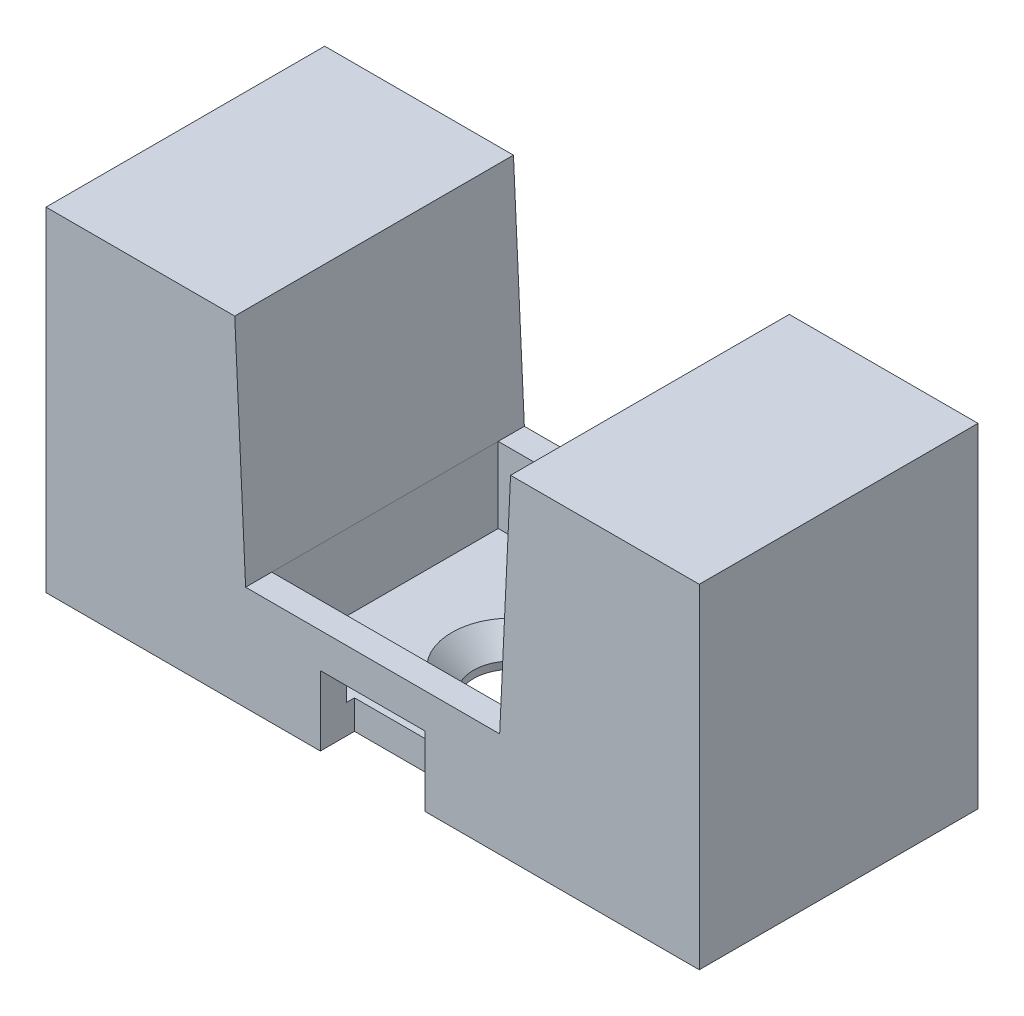
ISO-10303-21;
HEADER;
FILE_DESCRIPTION(('STEP AP214'),'2;1');
FILE_NAME('part.step','',(''),(''),'','','');
FILE_SCHEMA(('AUTOMOTIVE_DESIGN { 1 0 10303 214 1 1 1 1 }'));
ENDSEC;
DATA;
#1=APPLICATION_CONTEXT('core data for automotive mechanical design processes');
#2=APPLICATION_PROTOCOL_DEFINITION('international standard','automotive_design',2000,#1);
#3=PRODUCT_CONTEXT('',#1,'mechanical');
#4=PRODUCT('Part','Part','',(#3));
#5=PRODUCT_RELATED_PRODUCT_CATEGORY('part','',(#4));
#6=PRODUCT_DEFINITION_FORMATION('','',#4);
#7=PRODUCT_DEFINITION_CONTEXT('part definition',#1,'design');
#8=PRODUCT_DEFINITION('design','',#6,#7);
#9=PRODUCT_DEFINITION_SHAPE('','',#8);
#10=(LENGTH_UNIT() NAMED_UNIT(*) SI_UNIT(.MILLI.,.METRE.));
#11=(NAMED_UNIT(*) PLANE_ANGLE_UNIT() SI_UNIT($,.RADIAN.));
#12=(NAMED_UNIT(*) SI_UNIT($,.STERADIAN.) SOLID_ANGLE_UNIT());
#13=UNCERTAINTY_MEASURE_WITH_UNIT(LENGTH_MEASURE(1.E-05),#10,'distance_accuracy_value','');
#14=(GEOMETRIC_REPRESENTATION_CONTEXT(3) GLOBAL_UNCERTAINTY_ASSIGNED_CONTEXT((#13)) GLOBAL_UNIT_ASSIGNED_CONTEXT((#10,
#11,#12)) REPRESENTATION_CONTEXT('',''));
#15=CARTESIAN_POINT('',(0.,0.,0.));
#16=DIRECTION('',(0.,0.,1.));
#17=DIRECTION('',(1.,0.,0.));
#18=AXIS2_PLACEMENT_3D('',#15,#16,#17);
#19=CARTESIAN_POINT('',(-11.25,11.5,-4.8));
#20=DIRECTION('',(0.,0.,1.));
#21=DIRECTION('',(1.,0.,0.));
#22=AXIS2_PLACEMENT_3D('',#19,#20,#21);
#23=PLANE('',#22);
#24=DIRECTION('',(0.,-1.,0.));
#25=VECTOR('',#24,1.);
#26=CARTESIAN_POINT('',(-1.8,2.4,-4.8));
#27=LINE('',#26,#25);
#28=CARTESIAN_POINT('',(-1.8,2.4,-4.8));
#29=VERTEX_POINT('',#28);
#30=CARTESIAN_POINT('',(-1.8,0.,-4.8));
#31=VERTEX_POINT('',#30);
#32=EDGE_CURVE('E201',#29,#31,#27,.T.);
#33=ORIENTED_EDGE('',*,*,#32,.T.);
#34=DIRECTION('',(-1.,0.,0.));
#35=VECTOR('',#34,1.);
#36=CARTESIAN_POINT('',(-11.25,0.,-4.8));
#37=LINE('',#36,#35);
#38=CARTESIAN_POINT('',(-11.25,0.,-4.8));
#39=VERTEX_POINT('',#38);
#40=EDGE_CURVE('E404',#31,#39,#37,.T.);
#41=ORIENTED_EDGE('',*,*,#40,.T.);
#42=DIRECTION('',(0.,-1.,0.));
#43=VECTOR('',#42,1.);
#44=CARTESIAN_POINT('',(-11.25,11.5,-4.8));
#45=LINE('',#44,#43);
#46=CARTESIAN_POINT('',(-11.25,11.5,-4.8));
#47=VERTEX_POINT('',#46);
#48=EDGE_CURVE('E422',#47,#39,#45,.T.);
#49=ORIENTED_EDGE('',*,*,#48,.F.);
#50=DIRECTION('',(-1.,0.,0.));
#51=VECTOR('',#50,1.);
#52=CARTESIAN_POINT('',(-11.25,11.5,-4.8));
#53=LINE('',#52,#51);
#54=CARTESIAN_POINT('',(-4.75,11.5,-4.8));
#55=VERTEX_POINT('',#54);
#56=EDGE_CURVE('E386',#55,#47,#53,.T.);
#57=ORIENTED_EDGE('',*,*,#56,.F.);
#58=DIRECTION('',(0.0474149657284516,-0.998875278012711,0.));
#59=VECTOR('',#58,1.);
#60=CARTESIAN_POINT('',(-4.375,3.6,-4.8));
#61=LINE('',#60,#59);
#62=CARTESIAN_POINT('',(-4.375,3.6,-4.8));
#63=VERTEX_POINT('',#62);
#64=EDGE_CURVE('E342',#55,#63,#61,.T.);
#65=ORIENTED_EDGE('',*,*,#64,.T.);
#66=DIRECTION('',(1.,0.,0.));
#67=VECTOR('',#66,1.);
#68=CARTESIAN_POINT('',(4.375,3.6,-4.8));
#69=LINE('',#68,#67);
#70=CARTESIAN_POINT('',(4.375,3.6,-4.8));
#71=VERTEX_POINT('',#70);
#72=EDGE_CURVE('E346',#63,#71,#69,.T.);
#73=ORIENTED_EDGE('',*,*,#72,.T.);
#74=DIRECTION('',(0.0474149657284512,0.998875278012711,0.));
#75=VECTOR('',#74,1.);
#76=CARTESIAN_POINT('',(4.75,11.5,-4.8));
#77=LINE('',#76,#75);
#78=CARTESIAN_POINT('',(4.75,11.5,-4.8));
#79=VERTEX_POINT('',#78);
#80=EDGE_CURVE('E351',#71,#79,#77,.T.);
#81=ORIENTED_EDGE('',*,*,#80,.T.);
#82=CARTESIAN_POINT('',(11.25,11.5,-4.8));
#83=VERTEX_POINT('',#82);
#84=EDGE_CURVE('E388',#83,#79,#53,.T.);
#85=ORIENTED_EDGE('',*,*,#84,.F.);
#86=DIRECTION('',(0.,-1.,0.));
#87=VECTOR('',#86,1.);
#88=CARTESIAN_POINT('',(11.25,11.5,-4.8));
#89=LINE('',#88,#87);
#90=CARTESIAN_POINT('',(11.25,0.,-4.8));
#91=VERTEX_POINT('',#90);
#92=EDGE_CURVE('E426',#83,#91,#89,.T.);
#93=ORIENTED_EDGE('',*,*,#92,.T.);
#94=CARTESIAN_POINT('',(1.8,0.,-4.8));
#95=VERTEX_POINT('',#94);
#96=EDGE_CURVE('E405',#91,#95,#37,.T.);
#97=ORIENTED_EDGE('',*,*,#96,.T.);
#98=DIRECTION('',(0.,-1.,0.));
#99=VECTOR('',#98,1.);
#100=CARTESIAN_POINT('',(1.8,2.4,-4.8));
#101=LINE('',#100,#99);
#102=CARTESIAN_POINT('',(1.8,2.4,-4.8));
#103=VERTEX_POINT('',#102);
#104=EDGE_CURVE('E57',#103,#95,#101,.T.);
#105=ORIENTED_EDGE('',*,*,#104,.F.);
#106=DIRECTION('',(-1.,0.,0.));
#107=VECTOR('',#106,1.);
#108=CARTESIAN_POINT('',(-1.8,2.4,-4.8));
#109=LINE('',#108,#107);
#110=EDGE_CURVE('E218',#103,#29,#109,.T.);
#111=ORIENTED_EDGE('',*,*,#110,.T.);
#112=EDGE_LOOP('',(#33,#41,#49,#57,#65,#73,#81,#85,#93,#97,#105,#111));
#113=FACE_BOUND('',#112,.T.);
#114=ADVANCED_FACE('F41',(#113),#23,.F.);
#115=CARTESIAN_POINT('',(0.,0.,0.));
#116=DIRECTION('',(0.,1.,0.));
#117=DIRECTION('',(0.,0.,1.));
#118=AXIS2_PLACEMENT_3D('',#115,#116,#117);
#119=PLANE('',#118);
#120=CARTESIAN_POINT('',(0.,0.,0.));
#121=DIRECTION('',(0.,1.,0.));
#122=DIRECTION('',(0.,0.,1.));
#123=AXIS2_PLACEMENT_3D('',#120,#121,#122);
#124=CIRCLE('',#123,1.325);
#125=CARTESIAN_POINT('',(0.,0.,1.325));
#126=VERTEX_POINT('',#125);
#127=EDGE_CURVE('E293',#126,#126,#124,.T.);
#128=ORIENTED_EDGE('',*,*,#127,.T.);
#129=EDGE_LOOP('',(#128));
#130=FACE_BOUND('',#129,.T.);
#131=DIRECTION('',(0.,0.,1.));
#132=VECTOR('',#131,1.);
#133=CARTESIAN_POINT('',(-1.8,0.,-4.8));
#134=LINE('',#133,#132);
#135=CARTESIAN_POINT('',(-1.8,0.,-3.625));
#136=VERTEX_POINT('',#135);
#137=EDGE_CURVE('E207',#31,#136,#134,.T.);
#138=ORIENTED_EDGE('',*,*,#137,.T.);
#139=DIRECTION('',(1.,0.,0.));
#140=VECTOR('',#139,1.);
#141=CARTESIAN_POINT('',(-1.8,0.,-3.625));
#142=LINE('',#141,#140);
#143=CARTESIAN_POINT('',(1.8,0.,-3.625));
#144=VERTEX_POINT('',#143);
#145=EDGE_CURVE('E221',#136,#144,#142,.T.);
#146=ORIENTED_EDGE('',*,*,#145,.T.);
#147=DIRECTION('',(0.,0.,-1.));
#148=VECTOR('',#147,1.);
#149=CARTESIAN_POINT('',(1.8,0.,-4.8));
#150=LINE('',#149,#148);
#151=EDGE_CURVE('E231',#144,#95,#150,.T.);
#152=ORIENTED_EDGE('',*,*,#151,.T.);
#153=ORIENTED_EDGE('',*,*,#96,.F.);
#154=DIRECTION('',(0.,0.,-1.));
#155=VECTOR('',#154,1.);
#156=CARTESIAN_POINT('',(11.25,0.,-4.8));
#157=LINE('',#156,#155);
#158=CARTESIAN_POINT('',(11.25,0.,4.8));
#159=VERTEX_POINT('',#158);
#160=EDGE_CURVE('E369',#159,#91,#157,.T.);
#161=ORIENTED_EDGE('',*,*,#160,.F.);
#162=DIRECTION('',(1.,0.,0.));
#163=VECTOR('',#162,1.);
#164=CARTESIAN_POINT('',(-11.25,0.,4.8));
#165=LINE('',#164,#163);
#166=CARTESIAN_POINT('',(1.8,0.,4.8));
#167=VERTEX_POINT('',#166);
#168=EDGE_CURVE('E411',#167,#159,#165,.T.);
#169=ORIENTED_EDGE('',*,*,#168,.F.);
#170=DIRECTION('',(0.,0.,1.));
#171=VECTOR('',#170,1.);
#172=CARTESIAN_POINT('',(1.8,0.,4.8));
#173=LINE('',#172,#171);
#174=CARTESIAN_POINT('',(1.8,0.,3.625));
#175=VERTEX_POINT('',#174);
#176=EDGE_CURVE('E256',#175,#167,#173,.T.);
#177=ORIENTED_EDGE('',*,*,#176,.F.);
#178=DIRECTION('',(1.,0.,0.));
#179=VECTOR('',#178,1.);
#180=CARTESIAN_POINT('',(-1.8,0.,3.625));
#181=LINE('',#180,#179);
#182=CARTESIAN_POINT('',(-1.8,0.,3.625));
#183=VERTEX_POINT('',#182);
#184=EDGE_CURVE('E266',#183,#175,#181,.T.);
#185=ORIENTED_EDGE('',*,*,#184,.F.);
#186=DIRECTION('',(0.,0.,-1.));
#187=VECTOR('',#186,1.);
#188=CARTESIAN_POINT('',(-1.8,0.,4.8));
#189=LINE('',#188,#187);
#190=CARTESIAN_POINT('',(-1.8,0.,4.8));
#191=VERTEX_POINT('',#190);
#192=EDGE_CURVE('E250',#191,#183,#189,.T.);
#193=ORIENTED_EDGE('',*,*,#192,.F.);
#194=CARTESIAN_POINT('',(-11.25,0.,4.8));
#195=VERTEX_POINT('',#194);
#196=EDGE_CURVE('E387',#195,#191,#165,.T.);
#197=ORIENTED_EDGE('',*,*,#196,.F.);
#198=DIRECTION('',(0.,0.,1.));
#199=VECTOR('',#198,1.);
#200=CARTESIAN_POINT('',(-11.25,0.,-4.8));
#201=LINE('',#200,#199);
#202=EDGE_CURVE('E408',#39,#195,#201,.T.);
#203=ORIENTED_EDGE('',*,*,#202,.F.);
#204=ORIENTED_EDGE('',*,*,#40,.F.);
#205=EDGE_LOOP('',(#138,#146,#152,#153,#161,#169,#177,#185,#193,#197,#203,#204));
#206=FACE_BOUND('',#205,.T.);
#207=ADVANCED_FACE('F520',(#130,#206),#119,.F.);
#208=CARTESIAN_POINT('',(-4.375,-11.7218812483321,-3.9));
#209=DIRECTION('',(0.,0.,-1.));
#210=DIRECTION('',(-1.,0.,0.));
#211=AXIS2_PLACEMENT_3D('',#208,#209,#210);
#212=PLANE('',#211);
#213=DIRECTION('',(0.,-1.,0.));
#214=VECTOR('',#213,1.);
#215=CARTESIAN_POINT('',(-1.8,-11.7218812483321,-3.9));
#216=LINE('',#215,#214);
#217=CARTESIAN_POINT('',(-1.8,2.4,-3.9));
#218=VERTEX_POINT('',#217);
#219=CARTESIAN_POINT('',(-1.8,1.,-3.9));
#220=VERTEX_POINT('',#219);
#221=EDGE_CURVE('E247',#218,#220,#216,.T.);
#222=ORIENTED_EDGE('',*,*,#221,.F.);
#223=DIRECTION('',(-1.,0.,0.));
#224=VECTOR('',#223,1.);
#225=CARTESIAN_POINT('',(-4.375,2.4,-3.9));
#226=LINE('',#225,#224);
#227=CARTESIAN_POINT('',(1.8,2.4,-3.9));
#228=VERTEX_POINT('',#227);
#229=EDGE_CURVE('E12',#228,#218,#226,.T.);
#230=ORIENTED_EDGE('',*,*,#229,.F.);
#231=DIRECTION('',(0.,1.,0.));
#232=VECTOR('',#231,1.);
#233=CARTESIAN_POINT('',(1.8,-11.7218812483321,-3.9));
#234=LINE('',#233,#232);
#235=CARTESIAN_POINT('',(1.8,1.,-3.9));
#236=VERTEX_POINT('',#235);
#237=EDGE_CURVE('E240',#236,#228,#234,.T.);
#238=ORIENTED_EDGE('',*,*,#237,.F.);
#239=DIRECTION('',(1.,0.,0.));
#240=VECTOR('',#239,1.);
#241=CARTESIAN_POINT('',(-4.375,1.,-3.9));
#242=LINE('',#241,#240);
#243=CARTESIAN_POINT('',(4.375,1.,-3.9));
#244=VERTEX_POINT('',#243);
#245=EDGE_CURVE('E310',#236,#244,#242,.T.);
#246=ORIENTED_EDGE('',*,*,#245,.T.);
#247=DIRECTION('',(0.,1.,0.));
#248=VECTOR('',#247,1.);
#249=CARTESIAN_POINT('',(4.375,-11.7218812483321,-3.9));
#250=LINE('',#249,#248);
#251=CARTESIAN_POINT('',(4.375,3.6,-3.9));
#252=VERTEX_POINT('',#251);
#253=EDGE_CURVE('E325',#244,#252,#250,.T.);
#254=ORIENTED_EDGE('',*,*,#253,.T.);
#255=DIRECTION('',(-1.,0.,0.));
#256=VECTOR('',#255,1.);
#257=CARTESIAN_POINT('',(-4.375,3.6,-3.9));
#258=LINE('',#257,#256);
#259=CARTESIAN_POINT('',(-4.375,3.6,-3.9));
#260=VERTEX_POINT('',#259);
#261=EDGE_CURVE('E314',#252,#260,#258,.T.);
#262=ORIENTED_EDGE('',*,*,#261,.T.);
#263=DIRECTION('',(0.,1.,0.));
#264=VECTOR('',#263,1.);
#265=CARTESIAN_POINT('',(-4.375,-11.7218812483321,-3.9));
#266=LINE('',#265,#264);
#267=CARTESIAN_POINT('',(-4.375,1.,-3.9));
#268=VERTEX_POINT('',#267);
#269=EDGE_CURVE('E331',#268,#260,#266,.T.);
#270=ORIENTED_EDGE('',*,*,#269,.F.);
#271=EDGE_CURVE('E337',#268,#220,#242,.T.);
#272=ORIENTED_EDGE('',*,*,#271,.T.);
#273=EDGE_LOOP('',(#222,#230,#238,#246,#254,#262,#270,#272));
#274=FACE_BOUND('',#273,.T.);
#275=ADVANCED_FACE('F467',(#274),#212,.F.);
#276=CARTESIAN_POINT('',(0.,1.,0.));
#277=DIRECTION('',(0.,1.,0.));
#278=DIRECTION('',(0.,0.,1.));
#279=AXIS2_PLACEMENT_3D('',#276,#277,#278);
#280=PLANE('',#279);
#281=CARTESIAN_POINT('',(0.,1.,0.));
#282=DIRECTION('',(0.,1.,0.));
#283=DIRECTION('',(0.,0.,1.));
#284=AXIS2_PLACEMENT_3D('',#281,#282,#283);
#285=CIRCLE('',#284,2.075);
#286=CARTESIAN_POINT('',(0.,1.,2.075));
#287=VERTEX_POINT('',#286);
#288=EDGE_CURVE('E434',#287,#287,#285,.F.);
#289=ORIENTED_EDGE('',*,*,#288,.T.);
#290=EDGE_LOOP('',(#289));
#291=FACE_BOUND('',#290,.T.);
#292=DIRECTION('',(-1.,0.,0.));
#293=VECTOR('',#292,1.);
#294=CARTESIAN_POINT('',(0.,1.,-3.625));
#295=LINE('',#294,#293);
#296=CARTESIAN_POINT('',(1.8,1.,-3.625));
#297=VERTEX_POINT('',#296);
#298=CARTESIAN_POINT('',(-1.8,1.,-3.625));
#299=VERTEX_POINT('',#298);
#300=EDGE_CURVE('E455',#297,#299,#295,.T.);
#301=ORIENTED_EDGE('',*,*,#300,.T.);
#302=DIRECTION('',(0.,0.,-1.));
#303=VECTOR('',#302,1.);
#304=CARTESIAN_POINT('',(-1.8,1.,0.));
#305=LINE('',#304,#303);
#306=EDGE_CURVE('E50',#299,#220,#305,.T.);
#307=ORIENTED_EDGE('',*,*,#306,.T.);
#308=ORIENTED_EDGE('',*,*,#271,.F.);
#309=DIRECTION('',(0.,0.,-1.));
#310=VECTOR('',#309,1.);
#311=CARTESIAN_POINT('',(-4.375,1.,3.9));
#312=LINE('',#311,#310);
#313=CARTESIAN_POINT('',(-4.375,1.,3.9));
#314=VERTEX_POINT('',#313);
#315=EDGE_CURVE('E298',#314,#268,#312,.T.);
#316=ORIENTED_EDGE('',*,*,#315,.F.);
#317=DIRECTION('',(-1.,0.,0.));
#318=VECTOR('',#317,1.);
#319=CARTESIAN_POINT('',(-4.375,1.,3.9));
#320=LINE('',#319,#318);
#321=CARTESIAN_POINT('',(-1.8,1.,3.9));
#322=VERTEX_POINT('',#321);
#323=EDGE_CURVE('E301',#322,#314,#320,.T.);
#324=ORIENTED_EDGE('',*,*,#323,.F.);
#325=DIRECTION('',(0.,0.,1.));
#326=VECTOR('',#325,1.);
#327=CARTESIAN_POINT('',(-1.8,1.,0.));
#328=LINE('',#327,#326);
#329=CARTESIAN_POINT('',(-1.8,1.,3.625));
#330=VERTEX_POINT('',#329);
#331=EDGE_CURVE('E445',#330,#322,#328,.T.);
#332=ORIENTED_EDGE('',*,*,#331,.F.);
#333=DIRECTION('',(-1.,0.,0.));
#334=VECTOR('',#333,1.);
#335=CARTESIAN_POINT('',(0.,1.,3.625));
#336=LINE('',#335,#334);
#337=CARTESIAN_POINT('',(1.8,1.,3.625));
#338=VERTEX_POINT('',#337);
#339=EDGE_CURVE('E438',#338,#330,#336,.T.);
#340=ORIENTED_EDGE('',*,*,#339,.F.);
#341=DIRECTION('',(0.,0.,-1.));
#342=VECTOR('',#341,1.);
#343=CARTESIAN_POINT('',(1.8,1.,0.));
#344=LINE('',#343,#342);
#345=CARTESIAN_POINT('',(1.8,1.,3.9));
#346=VERTEX_POINT('',#345);
#347=EDGE_CURVE('E441',#346,#338,#344,.T.);
#348=ORIENTED_EDGE('',*,*,#347,.F.);
#349=CARTESIAN_POINT('',(4.375,1.,3.9));
#350=VERTEX_POINT('',#349);
#351=EDGE_CURVE('E303',#350,#346,#320,.T.);
#352=ORIENTED_EDGE('',*,*,#351,.F.);
#353=DIRECTION('',(0.,0.,1.));
#354=VECTOR('',#353,1.);
#355=CARTESIAN_POINT('',(4.375,1.,3.9));
#356=LINE('',#355,#354);
#357=EDGE_CURVE('E307',#244,#350,#356,.T.);
#358=ORIENTED_EDGE('',*,*,#357,.F.);
#359=ORIENTED_EDGE('',*,*,#245,.F.);
#360=DIRECTION('',(0.,0.,1.));
#361=VECTOR('',#360,1.);
#362=CARTESIAN_POINT('',(1.8,1.,0.));
#363=LINE('',#362,#361);
#364=EDGE_CURVE('E451',#236,#297,#363,.T.);
#365=ORIENTED_EDGE('',*,*,#364,.T.);
#366=EDGE_LOOP('',(#301,#307,#308,#316,#324,#332,#340,#348,#352,#358,#359,#365));
#367=FACE_BOUND('',#366,.T.);
#368=ADVANCED_FACE('F462',(#291,#367),#280,.T.);
#369=CARTESIAN_POINT('',(4.375,3.6,-4.8));
#370=DIRECTION('',(0.,-1.,0.));
#371=DIRECTION('',(0.,0.,-1.));
#372=AXIS2_PLACEMENT_3D('',#369,#370,#371);
#373=PLANE('',#372);
#374=DIRECTION('',(0.,0.,1.));
#375=VECTOR('',#374,1.);
#376=CARTESIAN_POINT('',(4.375,3.6,-4.8));
#377=LINE('',#376,#375);
#378=CARTESIAN_POINT('',(4.375,3.6,3.9));
#379=VERTEX_POINT('',#378);
#380=CARTESIAN_POINT('',(4.375,3.6,4.8));
#381=VERTEX_POINT('',#380);
#382=EDGE_CURVE('E374',#379,#381,#377,.T.);
#383=ORIENTED_EDGE('',*,*,#382,.F.);
#384=DIRECTION('',(1.,0.,0.));
#385=VECTOR('',#384,1.);
#386=CARTESIAN_POINT('',(-4.375,3.6,3.9));
#387=LINE('',#386,#385);
#388=CARTESIAN_POINT('',(-4.375,3.6,3.9));
#389=VERTEX_POINT('',#388);
#390=EDGE_CURVE('E321',#389,#379,#387,.T.);
#391=ORIENTED_EDGE('',*,*,#390,.F.);
#392=DIRECTION('',(0.,0.,1.));
#393=VECTOR('',#392,1.);
#394=CARTESIAN_POINT('',(-4.375,3.6,-4.8));
#395=LINE('',#394,#393);
#396=CARTESIAN_POINT('',(-4.375,3.6,4.8));
#397=VERTEX_POINT('',#396);
#398=EDGE_CURVE('E379',#389,#397,#395,.T.);
#399=ORIENTED_EDGE('',*,*,#398,.T.);
#400=DIRECTION('',(1.,0.,0.));
#401=VECTOR('',#400,1.);
#402=CARTESIAN_POINT('',(4.375,3.6,4.8));
#403=LINE('',#402,#401);
#404=EDGE_CURVE('E359',#397,#381,#403,.T.);
#405=ORIENTED_EDGE('',*,*,#404,.T.);
#406=EDGE_LOOP('',(#383,#391,#399,#405));
#407=FACE_BOUND('',#406,.T.);
#408=ADVANCED_FACE('F498',(#407),#373,.F.);
#409=CARTESIAN_POINT('',(0.,11.5,0.));
#410=DIRECTION('',(0.,1.,0.));
#411=DIRECTION('',(0.,0.,1.));
#412=AXIS2_PLACEMENT_3D('',#409,#410,#411);
#413=PLANE('',#412);
#414=DIRECTION('',(0.,0.,1.));
#415=VECTOR('',#414,1.);
#416=CARTESIAN_POINT('',(4.75,11.5,-4.8));
#417=LINE('',#416,#415);
#418=CARTESIAN_POINT('',(4.75,11.5,4.8));
#419=VERTEX_POINT('',#418);
#420=EDGE_CURVE('E365',#79,#419,#417,.T.);
#421=ORIENTED_EDGE('',*,*,#420,.T.);
#422=DIRECTION('',(1.,0.,0.));
#423=VECTOR('',#422,1.);
#424=CARTESIAN_POINT('',(-11.25,11.5,4.8));
#425=LINE('',#424,#423);
#426=CARTESIAN_POINT('',(11.25,11.5,4.8));
#427=VERTEX_POINT('',#426);
#428=EDGE_CURVE('E395',#419,#427,#425,.T.);
#429=ORIENTED_EDGE('',*,*,#428,.T.);
#430=DIRECTION('',(0.,0.,-1.));
#431=VECTOR('',#430,1.);
#432=CARTESIAN_POINT('',(11.25,11.5,-4.8));
#433=LINE('',#432,#431);
#434=EDGE_CURVE('E382',#427,#83,#433,.T.);
#435=ORIENTED_EDGE('',*,*,#434,.T.);
#436=ORIENTED_EDGE('',*,*,#84,.T.);
#437=EDGE_LOOP('',(#421,#429,#435,#436));
#438=FACE_BOUND('',#437,.T.);
#439=ADVANCED_FACE('F563',(#438),#413,.T.);
#440=CARTESIAN_POINT('',(11.25,11.5,-4.8));
#441=DIRECTION('',(-1.,0.,0.));
#442=DIRECTION('',(0.,0.,1.));
#443=AXIS2_PLACEMENT_3D('',#440,#441,#442);
#444=PLANE('',#443);
#445=ORIENTED_EDGE('',*,*,#160,.T.);
#446=ORIENTED_EDGE('',*,*,#92,.F.);
#447=ORIENTED_EDGE('',*,*,#434,.F.);
#448=DIRECTION('',(0.,-1.,0.));
#449=VECTOR('',#448,1.);
#450=CARTESIAN_POINT('',(11.25,11.5,4.8));
#451=LINE('',#450,#449);
#452=EDGE_CURVE('E400',#427,#159,#451,.T.);
#453=ORIENTED_EDGE('',*,*,#452,.T.);
#454=EDGE_LOOP('',(#445,#446,#447,#453));
#455=FACE_BOUND('',#454,.T.);
#456=ADVANCED_FACE('F561',(#455),#444,.F.);
#457=CARTESIAN_POINT('',(-11.25,11.5,-4.8));
#458=DIRECTION('',(1.,0.,0.));
#459=DIRECTION('',(0.,0.,-1.));
#460=AXIS2_PLACEMENT_3D('',#457,#458,#459);
#461=PLANE('',#460);
#462=ORIENTED_EDGE('',*,*,#202,.T.);
#463=DIRECTION('',(0.,-1.,0.));
#464=VECTOR('',#463,1.);
#465=CARTESIAN_POINT('',(-11.25,11.5,4.8));
#466=LINE('',#465,#464);
#467=CARTESIAN_POINT('',(-11.25,11.5,4.8));
#468=VERTEX_POINT('',#467);
#469=EDGE_CURVE('E418',#468,#195,#466,.T.);
#470=ORIENTED_EDGE('',*,*,#469,.F.);
#471=DIRECTION('',(0.,0.,1.));
#472=VECTOR('',#471,1.);
#473=CARTESIAN_POINT('',(-11.25,11.5,-4.8));
#474=LINE('',#473,#472);
#475=EDGE_CURVE('E392',#47,#468,#474,.T.);
#476=ORIENTED_EDGE('',*,*,#475,.F.);
#477=ORIENTED_EDGE('',*,*,#48,.T.);
#478=EDGE_LOOP('',(#462,#470,#476,#477));
#479=FACE_BOUND('',#478,.T.);
#480=ADVANCED_FACE('F559',(#479),#461,.F.);
#481=CARTESIAN_POINT('',(-11.25,11.5,4.8));
#482=DIRECTION('',(0.,0.,-1.));
#483=DIRECTION('',(-1.,0.,0.));
#484=AXIS2_PLACEMENT_3D('',#481,#482,#483);
#485=PLANE('',#484);
#486=ORIENTED_EDGE('',*,*,#196,.T.);
#487=DIRECTION('',(0.,-1.,0.));
#488=VECTOR('',#487,1.);
#489=CARTESIAN_POINT('',(-1.8,2.4,4.8));
#490=LINE('',#489,#488);
#491=CARTESIAN_POINT('',(-1.8,2.4,4.8));
#492=VERTEX_POINT('',#491);
#493=EDGE_CURVE('E272',#492,#191,#490,.T.);
#494=ORIENTED_EDGE('',*,*,#493,.F.);
#495=DIRECTION('',(-1.,0.,0.));
#496=VECTOR('',#495,1.);
#497=CARTESIAN_POINT('',(-1.8,2.4,4.8));
#498=LINE('',#497,#496);
#499=CARTESIAN_POINT('',(1.8,2.4,4.8));
#500=VERTEX_POINT('',#499);
#501=EDGE_CURVE('E259',#500,#492,#498,.T.);
#502=ORIENTED_EDGE('',*,*,#501,.F.);
#503=DIRECTION('',(0.,-1.,0.));
#504=VECTOR('',#503,1.);
#505=CARTESIAN_POINT('',(1.8,2.4,4.8));
#506=LINE('',#505,#504);
#507=EDGE_CURVE('E276',#500,#167,#506,.T.);
#508=ORIENTED_EDGE('',*,*,#507,.T.);
#509=ORIENTED_EDGE('',*,*,#168,.T.);
#510=ORIENTED_EDGE('',*,*,#452,.F.);
#511=ORIENTED_EDGE('',*,*,#428,.F.);
#512=DIRECTION('',(0.0474149657284512,0.998875278012711,0.));
#513=VECTOR('',#512,1.);
#514=CARTESIAN_POINT('',(4.75,11.5,4.8));
#515=LINE('',#514,#513);
#516=EDGE_CURVE('E347',#381,#419,#515,.T.);
#517=ORIENTED_EDGE('',*,*,#516,.F.);
#518=ORIENTED_EDGE('',*,*,#404,.F.);
#519=DIRECTION('',(0.0474149657284516,-0.998875278012711,0.));
#520=VECTOR('',#519,1.);
#521=CARTESIAN_POINT('',(-4.375,3.6,4.8));
#522=LINE('',#521,#520);
#523=CARTESIAN_POINT('',(-4.75,11.5,4.8));
#524=VERTEX_POINT('',#523);
#525=EDGE_CURVE('E341',#524,#397,#522,.T.);
#526=ORIENTED_EDGE('',*,*,#525,.F.);
#527=EDGE_CURVE('E396',#468,#524,#425,.T.);
#528=ORIENTED_EDGE('',*,*,#527,.F.);
#529=ORIENTED_EDGE('',*,*,#469,.T.);
#530=EDGE_LOOP('',(#486,#494,#502,#508,#509,#510,#511,#517,#518,#526,#528,#529));
#531=FACE_BOUND('',#530,.T.);
#532=ADVANCED_FACE('F491',(#531),#485,.F.);
#533=DIRECTION('',(0.,0.,1.));
#534=VECTOR('',#533,1.);
#535=CARTESIAN_POINT('',(-4.75,11.5,-4.8));
#536=LINE('',#535,#534);
#537=EDGE_CURVE('E355',#55,#524,#536,.T.);
#538=ORIENTED_EDGE('',*,*,#537,.F.);
#539=ORIENTED_EDGE('',*,*,#56,.T.);
#540=ORIENTED_EDGE('',*,*,#475,.T.);
#541=ORIENTED_EDGE('',*,*,#527,.T.);
#542=EDGE_LOOP('',(#538,#539,#540,#541));
#543=FACE_BOUND('',#542,.T.);
#544=ADVANCED_FACE('F486',(#543),#413,.T.);
#545=CARTESIAN_POINT('',(4.75,11.5,-4.8));
#546=DIRECTION('',(0.998875278012711,-0.0474149657284511,0.));
#547=DIRECTION('',(0.0474149657284511,0.998875278012711,0.));
#548=AXIS2_PLACEMENT_3D('',#545,#546,#547);
#549=PLANE('',#548);
#550=ORIENTED_EDGE('',*,*,#516,.T.);
#551=ORIENTED_EDGE('',*,*,#420,.F.);
#552=ORIENTED_EDGE('',*,*,#80,.F.);
#553=EDGE_CURVE('E370',#71,#252,#377,.T.);
#554=ORIENTED_EDGE('',*,*,#553,.T.);
#555=DIRECTION('',(0.,0.,-1.));
#556=VECTOR('',#555,1.);
#557=CARTESIAN_POINT('',(4.375,3.6,3.9));
#558=LINE('',#557,#556);
#559=EDGE_CURVE('E297',#379,#252,#558,.T.);
#560=ORIENTED_EDGE('',*,*,#559,.F.);
#561=ORIENTED_EDGE('',*,*,#382,.T.);
#562=EDGE_LOOP('',(#550,#551,#552,#554,#560,#561));
#563=FACE_BOUND('',#562,.T.);
#564=ADVANCED_FACE('F579',(#563),#549,.F.);
#565=EDGE_CURVE('E375',#63,#260,#395,.T.);
#566=ORIENTED_EDGE('',*,*,#565,.T.);
#567=ORIENTED_EDGE('',*,*,#261,.F.);
#568=ORIENTED_EDGE('',*,*,#553,.F.);
#569=ORIENTED_EDGE('',*,*,#72,.F.);
#570=EDGE_LOOP('',(#566,#567,#568,#569));
#571=FACE_BOUND('',#570,.T.);
#572=ADVANCED_FACE('F479',(#571),#373,.F.);
#573=CARTESIAN_POINT('',(-4.375,3.6,-4.8));
#574=DIRECTION('',(-0.99887527801271,-0.0474149657284516,0.));
#575=DIRECTION('',(0.0474149657284516,-0.998875278012711,0.));
#576=AXIS2_PLACEMENT_3D('',#573,#574,#575);
#577=PLANE('',#576);
#578=ORIENTED_EDGE('',*,*,#525,.T.);
#579=ORIENTED_EDGE('',*,*,#398,.F.);
#580=DIRECTION('',(0.,0.,1.));
#581=VECTOR('',#580,1.);
#582=CARTESIAN_POINT('',(-4.375,3.6,3.9));
#583=LINE('',#582,#581);
#584=EDGE_CURVE('E317',#260,#389,#583,.T.);
#585=ORIENTED_EDGE('',*,*,#584,.F.);
#586=ORIENTED_EDGE('',*,*,#565,.F.);
#587=ORIENTED_EDGE('',*,*,#64,.F.);
#588=ORIENTED_EDGE('',*,*,#537,.T.);
#589=EDGE_LOOP('',(#578,#579,#585,#586,#587,#588));
#590=FACE_BOUND('',#589,.T.);
#591=ADVANCED_FACE('F476',(#590),#577,.F.);
#592=CARTESIAN_POINT('',(4.375,-11.7218812483321,3.9));
#593=DIRECTION('',(1.,0.,0.));
#594=DIRECTION('',(0.,0.,-1.));
#595=AXIS2_PLACEMENT_3D('',#592,#593,#594);
#596=PLANE('',#595);
#597=ORIENTED_EDGE('',*,*,#357,.T.);
#598=DIRECTION('',(0.,1.,0.));
#599=VECTOR('',#598,1.);
#600=CARTESIAN_POINT('',(4.375,-11.7218812483321,3.9));
#601=LINE('',#600,#599);
#602=EDGE_CURVE('E302',#350,#379,#601,.T.);
#603=ORIENTED_EDGE('',*,*,#602,.T.);
#604=ORIENTED_EDGE('',*,*,#559,.T.);
#605=ORIENTED_EDGE('',*,*,#253,.F.);
#606=EDGE_LOOP('',(#597,#603,#604,#605));
#607=FACE_BOUND('',#606,.T.);
#608=ADVANCED_FACE('F538',(#607),#596,.F.);
#609=CARTESIAN_POINT('',(-4.375,-11.7218812483321,3.9));
#610=DIRECTION('',(0.,0.,1.));
#611=DIRECTION('',(1.,0.,0.));
#612=AXIS2_PLACEMENT_3D('',#609,#610,#611);
#613=PLANE('',#612);
#614=DIRECTION('',(1.,0.,0.));
#615=VECTOR('',#614,1.);
#616=CARTESIAN_POINT('',(-4.375,2.4,3.9));
#617=LINE('',#616,#615);
#618=CARTESIAN_POINT('',(-1.8,2.4,3.9));
#619=VERTEX_POINT('',#618);
#620=CARTESIAN_POINT('',(1.8,2.4,3.9));
#621=VERTEX_POINT('',#620);
#622=EDGE_CURVE('E448',#619,#621,#617,.T.);
#623=ORIENTED_EDGE('',*,*,#622,.F.);
#624=DIRECTION('',(0.,-1.,0.));
#625=VECTOR('',#624,1.);
#626=CARTESIAN_POINT('',(-1.8,-11.7218812483321,3.9));
#627=LINE('',#626,#625);
#628=EDGE_CURVE('E289',#619,#322,#627,.T.);
#629=ORIENTED_EDGE('',*,*,#628,.T.);
#630=ORIENTED_EDGE('',*,*,#323,.T.);
#631=DIRECTION('',(0.,1.,0.));
#632=VECTOR('',#631,1.);
#633=CARTESIAN_POINT('',(-4.375,-11.7218812483321,3.9));
#634=LINE('',#633,#632);
#635=EDGE_CURVE('E328',#314,#389,#634,.T.);
#636=ORIENTED_EDGE('',*,*,#635,.T.);
#637=ORIENTED_EDGE('',*,*,#390,.T.);
#638=ORIENTED_EDGE('',*,*,#602,.F.);
#639=ORIENTED_EDGE('',*,*,#351,.T.);
#640=DIRECTION('',(0.,1.,0.));
#641=VECTOR('',#640,1.);
#642=CARTESIAN_POINT('',(1.8,-11.7218812483321,3.9));
#643=LINE('',#642,#641);
#644=EDGE_CURVE('E275',#346,#621,#643,.T.);
#645=ORIENTED_EDGE('',*,*,#644,.T.);
#646=EDGE_LOOP('',(#623,#629,#630,#636,#637,#638,#639,#645));
#647=FACE_BOUND('',#646,.T.);
#648=ADVANCED_FACE('F507',(#647),#613,.F.);
#649=CARTESIAN_POINT('',(-4.375,-11.7218812483321,3.9));
#650=DIRECTION('',(-1.,0.,0.));
#651=DIRECTION('',(0.,0.,1.));
#652=AXIS2_PLACEMENT_3D('',#649,#650,#651);
#653=PLANE('',#652);
#654=ORIENTED_EDGE('',*,*,#315,.T.);
#655=ORIENTED_EDGE('',*,*,#269,.T.);
#656=ORIENTED_EDGE('',*,*,#584,.T.);
#657=ORIENTED_EDGE('',*,*,#635,.F.);
#658=EDGE_LOOP('',(#654,#655,#656,#657));
#659=FACE_BOUND('',#658,.T.);
#660=ADVANCED_FACE('F471',(#659),#653,.F.);
#661=CARTESIAN_POINT('',(0.,0.,0.));
#662=DIRECTION('',(0.,1.,0.));
#663=DIRECTION('',(0.,0.,1.));
#664=AXIS2_PLACEMENT_3D('',#661,#662,#663);
#665=CYLINDRICAL_SURFACE('',#664,1.325);
#666=CARTESIAN_POINT('',(0.,0.249999999999999,0.));
#667=DIRECTION('',(0.,1.,0.));
#668=DIRECTION('',(0.,0.,1.));
#669=AXIS2_PLACEMENT_3D('',#666,#667,#668);
#670=CIRCLE('',#669,1.325);
#671=CARTESIAN_POINT('',(0.,0.249999999999999,1.325));
#672=VERTEX_POINT('',#671);
#673=EDGE_CURVE('E430',#672,#672,#670,.T.);
#674=ORIENTED_EDGE('',*,*,#673,.T.);
#675=EDGE_LOOP('',(#674));
#676=FACE_BOUND('',#675,.T.);
#677=ORIENTED_EDGE('',*,*,#127,.F.);
#678=EDGE_LOOP('',(#677));
#679=FACE_BOUND('',#678,.T.);
#680=ADVANCED_FACE('F647',(#676,#679),#665,.F.);
#681=CARTESIAN_POINT('',(0.,0.249999999999999,0.));
#682=DIRECTION('',(0.,1.,0.));
#683=DIRECTION('',(0.,0.,1.));
#684=AXIS2_PLACEMENT_3D('',#681,#682,#683);
#685=CONICAL_SURFACE('',#684,1.325,0.78539816339745);
#686=CARTESIAN_POINT('',(0.,1.,2.075));
#687=CARTESIAN_POINT('',(0.,0.9921875,2.0671875));
#688=CARTESIAN_POINT('',(0.,0.984375,2.059375));
#689=CARTESIAN_POINT('',(0.,0.96875,2.04375));
#690=CARTESIAN_POINT('',(0.,0.9609375,2.0359375));
#691=CARTESIAN_POINT('',(0.,0.9453125,2.0203125));
#692=CARTESIAN_POINT('',(0.,0.9375,2.0125));
#693=CARTESIAN_POINT('',(0.,0.921875,1.996875));
#694=CARTESIAN_POINT('',(0.,0.9140625,1.9890625));
#695=CARTESIAN_POINT('',(0.,0.8984375,1.9734375));
#696=CARTESIAN_POINT('',(0.,0.890625,1.965625));
#697=CARTESIAN_POINT('',(0.,0.875,1.95));
#698=CARTESIAN_POINT('',(0.,0.8671875,1.9421875));
#699=CARTESIAN_POINT('',(0.,0.8515625,1.9265625));
#700=CARTESIAN_POINT('',(0.,0.84375,1.91875));
#701=CARTESIAN_POINT('',(0.,0.828125,1.903125));
#702=CARTESIAN_POINT('',(0.,0.8203125,1.8953125));
#703=CARTESIAN_POINT('',(0.,0.8046875,1.8796875));
#704=CARTESIAN_POINT('',(0.,0.796875,1.871875));
#705=CARTESIAN_POINT('',(0.,0.78125,1.85625));
#706=CARTESIAN_POINT('',(0.,0.773437499999999,1.8484375));
#707=CARTESIAN_POINT('',(0.,0.757812499999999,1.8328125));
#708=CARTESIAN_POINT('',(0.,0.749999999999999,1.825));
#709=CARTESIAN_POINT('',(0.,0.734374999999999,1.809375));
#710=CARTESIAN_POINT('',(0.,0.726562499999999,1.8015625));
#711=CARTESIAN_POINT('',(0.,0.710937499999999,1.7859375));
#712=CARTESIAN_POINT('',(0.,0.703124999999999,1.778125));
#713=CARTESIAN_POINT('',(0.,0.687499999999999,1.7625));
#714=CARTESIAN_POINT('',(0.,0.679687499999999,1.7546875));
#715=CARTESIAN_POINT('',(0.,0.664062499999999,1.7390625));
#716=CARTESIAN_POINT('',(0.,0.656249999999999,1.73125));
#717=CARTESIAN_POINT('',(0.,0.640624999999999,1.715625));
#718=CARTESIAN_POINT('',(0.,0.632812499999999,1.7078125));
#719=CARTESIAN_POINT('',(0.,0.617187499999999,1.6921875));
#720=CARTESIAN_POINT('',(0.,0.609374999999999,1.684375));
#721=CARTESIAN_POINT('',(0.,0.593749999999999,1.66875));
#722=CARTESIAN_POINT('',(0.,0.585937499999999,1.6609375));
#723=CARTESIAN_POINT('',(0.,0.570312499999999,1.6453125));
#724=CARTESIAN_POINT('',(0.,0.562499999999999,1.6375));
#725=CARTESIAN_POINT('',(0.,0.546874999999999,1.621875));
#726=CARTESIAN_POINT('',(0.,0.539062499999999,1.6140625));
#727=CARTESIAN_POINT('',(0.,0.523437499999999,1.5984375));
#728=CARTESIAN_POINT('',(0.,0.515624999999999,1.590625));
#729=CARTESIAN_POINT('',(0.,0.499999999999999,1.575));
#730=CARTESIAN_POINT('',(0.,0.492187499999999,1.5671875));
#731=CARTESIAN_POINT('',(0.,0.476562499999999,1.5515625));
#732=CARTESIAN_POINT('',(0.,0.468749999999999,1.54375));
#733=CARTESIAN_POINT('',(0.,0.453124999999999,1.528125));
#734=CARTESIAN_POINT('',(0.,0.445312499999999,1.5203125));
#735=CARTESIAN_POINT('',(0.,0.429687499999999,1.5046875));
#736=CARTESIAN_POINT('',(0.,0.421874999999999,1.496875));
#737=CARTESIAN_POINT('',(0.,0.406249999999999,1.48125));
#738=CARTESIAN_POINT('',(0.,0.398437499999999,1.4734375));
#739=CARTESIAN_POINT('',(0.,0.382812499999999,1.4578125));
#740=CARTESIAN_POINT('',(0.,0.374999999999999,1.45));
#741=CARTESIAN_POINT('',(0.,0.359374999999999,1.434375));
#742=CARTESIAN_POINT('',(0.,0.351562499999999,1.4265625));
#743=CARTESIAN_POINT('',(0.,0.335937499999999,1.4109375));
#744=CARTESIAN_POINT('',(0.,0.328124999999999,1.403125));
#745=CARTESIAN_POINT('',(0.,0.312499999999999,1.3875));
#746=CARTESIAN_POINT('',(0.,0.304687499999999,1.3796875));
#747=CARTESIAN_POINT('',(0.,0.289062499999998,1.3640625));
#748=CARTESIAN_POINT('',(0.,0.281249999999999,1.35625));
#749=CARTESIAN_POINT('',(0.,0.265624999999999,1.340625));
#750=CARTESIAN_POINT('',(0.,0.257812499999999,1.3328125));
#751=CARTESIAN_POINT('',(0.,0.249999999999999,1.325));
#752=B_SPLINE_CURVE_WITH_KNOTS('',3,(#686,#687,#688,#689,#690,#691,#692,#693,#694,#695,#696,
#697,#698,#699,#700,#701,#702,#703,#704,#705,#706,#707,#708,#709,#710,#711,#712,#713,#714,#715,
#716,#717,#718,#719,#720,#721,#722,#723,#724,#725,#726,#727,#728,#729,#730,#731,#732,#733,#734,
#735,#736,#737,#738,#739,#740,#741,#742,#743,#744,#745,#746,#747,#748,#749,#750,#751),
.UNSPECIFIED.,.F.,.F.,(4,2,2,2,2,2,2,2,2,2,2,2,2,2,2,2,2,2,2,2,2,2,2,2,2,2,2,2,2,2,2,2,4),(0.,
0.0331456303681195,0.066291260736239,0.0994368911043588,0.132582521472478,0.165728151840598,
0.198873782208718,0.232019412576837,0.265165042944956,0.298310673313076,0.331456303681195,
0.364601934049315,0.397747564417435,0.430893194785554,0.464038825153674,0.497184455521793,
0.530330085889913,0.563475716258032,0.596621346626152,0.629766976994271,0.662912607362391,
0.69605823773051,0.72920386809863,0.762349498466749,0.795495128834869,0.828640759202989,
0.861786389571108,0.894932019939228,0.928077650307347,0.961223280675467,0.994368911043586,
1.02751454141171,1.06066017177983),.UNSPECIFIED.);
#753=EDGE_CURVE('BSEAM43',#287,#672,#752,.T.);
#754=ORIENTED_EDGE('',*,*,#288,.F.);
#755=ORIENTED_EDGE('',*,*,#673,.F.);
#756=ORIENTED_EDGE('',*,*,#753,.T.);
#757=ORIENTED_EDGE('',*,*,#753,.F.);
#758=EDGE_LOOP('',(#754,#756,#755,#757));
#759=FACE_BOUND('',#758,.T.);
#760=ADVANCED_FACE('F43',(#759),#685,.F.);
#761=CARTESIAN_POINT('',(0.,2.4,0.));
#762=DIRECTION('',(0.,-1.,0.));
#763=DIRECTION('',(0.,0.,-1.));
#764=AXIS2_PLACEMENT_3D('',#761,#762,#763);
#765=PLANE('',#764);
#766=ORIENTED_EDGE('',*,*,#622,.T.);
#767=DIRECTION('',(0.,0.,1.));
#768=VECTOR('',#767,1.);
#769=CARTESIAN_POINT('',(1.8,2.4,4.8));
#770=LINE('',#769,#768);
#771=EDGE_CURVE('E255',#621,#500,#770,.T.);
#772=ORIENTED_EDGE('',*,*,#771,.T.);
#773=ORIENTED_EDGE('',*,*,#501,.T.);
#774=DIRECTION('',(0.,0.,-1.));
#775=VECTOR('',#774,1.);
#776=CARTESIAN_POINT('',(-1.8,2.4,4.8));
#777=LINE('',#776,#775);
#778=EDGE_CURVE('E251',#492,#619,#777,.T.);
#779=ORIENTED_EDGE('',*,*,#778,.T.);
#780=EDGE_LOOP('',(#766,#772,#773,#779));
#781=FACE_BOUND('',#780,.T.);
#782=ADVANCED_FACE('F531',(#781),#765,.T.);
#783=CARTESIAN_POINT('',(-1.8,2.4,4.8));
#784=DIRECTION('',(-1.,0.,0.));
#785=DIRECTION('',(0.,0.,1.));
#786=AXIS2_PLACEMENT_3D('',#783,#784,#785);
#787=PLANE('',#786);
#788=ORIENTED_EDGE('',*,*,#778,.F.);
#789=ORIENTED_EDGE('',*,*,#493,.T.);
#790=ORIENTED_EDGE('',*,*,#192,.T.);
#791=DIRECTION('',(0.,-1.,0.));
#792=VECTOR('',#791,1.);
#793=CARTESIAN_POINT('',(-1.8,2.4,3.625));
#794=LINE('',#793,#792);
#795=EDGE_CURVE('E263',#330,#183,#794,.T.);
#796=ORIENTED_EDGE('',*,*,#795,.F.);
#797=ORIENTED_EDGE('',*,*,#331,.T.);
#798=ORIENTED_EDGE('',*,*,#628,.F.);
#799=EDGE_LOOP('',(#788,#789,#790,#796,#797,#798));
#800=FACE_BOUND('',#799,.T.);
#801=ADVANCED_FACE('F513',(#800),#787,.F.);
#802=CARTESIAN_POINT('',(1.8,2.4,4.8));
#803=DIRECTION('',(1.,0.,0.));
#804=DIRECTION('',(0.,0.,-1.));
#805=AXIS2_PLACEMENT_3D('',#802,#803,#804);
#806=PLANE('',#805);
#807=ORIENTED_EDGE('',*,*,#347,.T.);
#808=DIRECTION('',(0.,-1.,0.));
#809=VECTOR('',#808,1.);
#810=CARTESIAN_POINT('',(1.8,2.4,3.625));
#811=LINE('',#810,#809);
#812=EDGE_CURVE('E280',#338,#175,#811,.T.);
#813=ORIENTED_EDGE('',*,*,#812,.T.);
#814=ORIENTED_EDGE('',*,*,#176,.T.);
#815=ORIENTED_EDGE('',*,*,#507,.F.);
#816=ORIENTED_EDGE('',*,*,#771,.F.);
#817=ORIENTED_EDGE('',*,*,#644,.F.);
#818=EDGE_LOOP('',(#807,#813,#814,#815,#816,#817));
#819=FACE_BOUND('',#818,.T.);
#820=ADVANCED_FACE('F525',(#819),#806,.F.);
#821=CARTESIAN_POINT('',(-1.8,2.4,3.625));
#822=DIRECTION('',(0.,0.,-1.));
#823=DIRECTION('',(-1.,0.,0.));
#824=AXIS2_PLACEMENT_3D('',#821,#822,#823);
#825=PLANE('',#824);
#826=ORIENTED_EDGE('',*,*,#339,.T.);
#827=ORIENTED_EDGE('',*,*,#795,.T.);
#828=ORIENTED_EDGE('',*,*,#184,.T.);
#829=ORIENTED_EDGE('',*,*,#812,.F.);
#830=EDGE_LOOP('',(#826,#827,#828,#829));
#831=FACE_BOUND('',#830,.T.);
#832=ADVANCED_FACE('F517',(#831),#825,.F.);
#833=CARTESIAN_POINT('',(0.,2.4,0.));
#834=DIRECTION('',(0.,-1.,0.));
#835=DIRECTION('',(0.,0.,1.));
#836=AXIS2_PLACEMENT_3D('',#833,#834,#835);
#837=PLANE('',#836);
#838=ORIENTED_EDGE('',*,*,#229,.T.);
#839=DIRECTION('',(0.,0.,1.));
#840=VECTOR('',#839,1.);
#841=CARTESIAN_POINT('',(-1.8,2.4,-4.8));
#842=LINE('',#841,#840);
#843=EDGE_CURVE('E204',#29,#218,#842,.T.);
#844=ORIENTED_EDGE('',*,*,#843,.F.);
#845=ORIENTED_EDGE('',*,*,#110,.F.);
#846=DIRECTION('',(0.,0.,-1.));
#847=VECTOR('',#846,1.);
#848=CARTESIAN_POINT('',(1.8,2.4,-4.8));
#849=LINE('',#848,#847);
#850=EDGE_CURVE('E212',#228,#103,#849,.T.);
#851=ORIENTED_EDGE('',*,*,#850,.F.);
#852=EDGE_LOOP('',(#838,#844,#845,#851));
#853=FACE_BOUND('',#852,.T.);
#854=ADVANCED_FACE('F216',(#853),#837,.T.);
#855=CARTESIAN_POINT('',(-1.8,2.4,-4.8));
#856=DIRECTION('',(1.,0.,0.));
#857=DIRECTION('',(0.,0.,-1.));
#858=AXIS2_PLACEMENT_3D('',#855,#856,#857);
#859=PLANE('',#858);
#860=ORIENTED_EDGE('',*,*,#221,.T.);
#861=ORIENTED_EDGE('',*,*,#306,.F.);
#862=DIRECTION('',(0.,-1.,0.));
#863=VECTOR('',#862,1.);
#864=CARTESIAN_POINT('',(-1.8,2.4,-3.625));
#865=LINE('',#864,#863);
#866=EDGE_CURVE('E237',#299,#136,#865,.T.);
#867=ORIENTED_EDGE('',*,*,#866,.T.);
#868=ORIENTED_EDGE('',*,*,#137,.F.);
#869=ORIENTED_EDGE('',*,*,#32,.F.);
#870=ORIENTED_EDGE('',*,*,#843,.T.);
#871=EDGE_LOOP('',(#860,#861,#867,#868,#869,#870));
#872=FACE_BOUND('',#871,.T.);
#873=ADVANCED_FACE('F203',(#872),#859,.T.);
#874=CARTESIAN_POINT('',(1.8,2.4,-4.8));
#875=DIRECTION('',(-1.,0.,0.));
#876=DIRECTION('',(0.,0.,1.));
#877=AXIS2_PLACEMENT_3D('',#874,#875,#876);
#878=PLANE('',#877);
#879=ORIENTED_EDGE('',*,*,#237,.T.);
#880=ORIENTED_EDGE('',*,*,#850,.T.);
#881=ORIENTED_EDGE('',*,*,#104,.T.);
#882=ORIENTED_EDGE('',*,*,#151,.F.);
#883=DIRECTION('',(0.,-1.,0.));
#884=VECTOR('',#883,1.);
#885=CARTESIAN_POINT('',(1.8,2.4,-3.625));
#886=LINE('',#885,#884);
#887=EDGE_CURVE('E63',#297,#144,#886,.T.);
#888=ORIENTED_EDGE('',*,*,#887,.F.);
#889=ORIENTED_EDGE('',*,*,#364,.F.);
#890=EDGE_LOOP('',(#879,#880,#881,#882,#888,#889));
#891=FACE_BOUND('',#890,.T.);
#892=ADVANCED_FACE('F540',(#891),#878,.T.);
#893=CARTESIAN_POINT('',(-1.8,2.4,-3.625));
#894=DIRECTION('',(0.,0.,-1.));
#895=DIRECTION('',(-1.,0.,0.));
#896=AXIS2_PLACEMENT_3D('',#893,#894,#895);
#897=PLANE('',#896);
#898=ORIENTED_EDGE('',*,*,#887,.T.);
#899=ORIENTED_EDGE('',*,*,#145,.F.);
#900=ORIENTED_EDGE('',*,*,#866,.F.);
#901=ORIENTED_EDGE('',*,*,#300,.F.);
#902=EDGE_LOOP('',(#898,#899,#900,#901));
#903=FACE_BOUND('',#902,.T.);
#904=ADVANCED_FACE('F542',(#903),#897,.T.);
#905=CLOSED_SHELL('',(#114,#207,#275,#368,#408,#439,#456,#480,#532,#544,#564,#572,#591,#608,
#648,#660,#680,#760,#782,#801,#820,#832,#854,#873,#892,#904));
#906=MANIFOLD_SOLID_BREP('B2',#905);
#907=ADVANCED_BREP_SHAPE_REPRESENTATION('',(#18,#906),#14);
#908=SHAPE_DEFINITION_REPRESENTATION(#9,#907);
ENDSEC;
END-ISO-10303-21;
